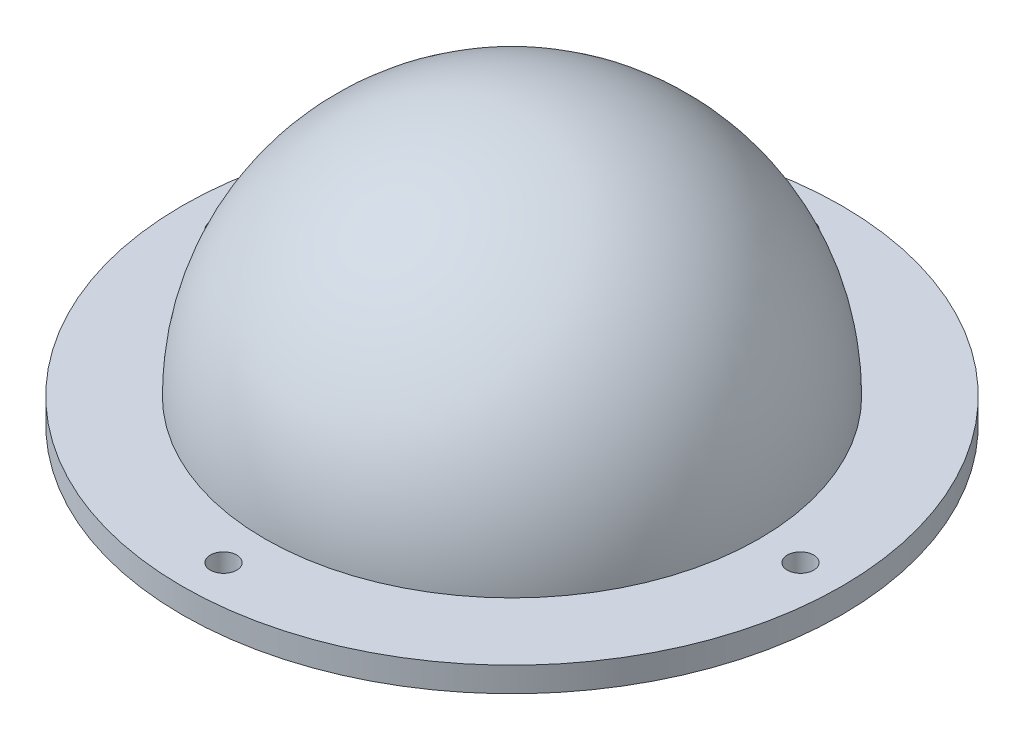
ISO-10303-21;
HEADER;
FILE_DESCRIPTION(('STEP AP214'),'2;1');
FILE_NAME('part.step','',(''),(''),'','','');
FILE_SCHEMA(('AUTOMOTIVE_DESIGN { 1 0 10303 214 1 1 1 1 }'));
ENDSEC;
DATA;
#1=APPLICATION_CONTEXT('core data for automotive mechanical design processes');
#2=APPLICATION_PROTOCOL_DEFINITION('international standard','automotive_design',2000,#1);
#3=PRODUCT_CONTEXT('',#1,'mechanical');
#4=PRODUCT('Part','Part','',(#3));
#5=PRODUCT_RELATED_PRODUCT_CATEGORY('part','',(#4));
#6=PRODUCT_DEFINITION_FORMATION('','',#4);
#7=PRODUCT_DEFINITION_CONTEXT('part definition',#1,'design');
#8=PRODUCT_DEFINITION('design','',#6,#7);
#9=PRODUCT_DEFINITION_SHAPE('','',#8);
#10=(LENGTH_UNIT() NAMED_UNIT(*) SI_UNIT(.MILLI.,.METRE.));
#11=(NAMED_UNIT(*) PLANE_ANGLE_UNIT() SI_UNIT($,.RADIAN.));
#12=(NAMED_UNIT(*) SI_UNIT($,.STERADIAN.) SOLID_ANGLE_UNIT());
#13=UNCERTAINTY_MEASURE_WITH_UNIT(LENGTH_MEASURE(1.E-05),#10,'distance_accuracy_value','');
#14=(GEOMETRIC_REPRESENTATION_CONTEXT(3) GLOBAL_UNCERTAINTY_ASSIGNED_CONTEXT((#13)) GLOBAL_UNIT_ASSIGNED_CONTEXT((#10,
#11,#12)) REPRESENTATION_CONTEXT('',''));
#15=CARTESIAN_POINT('',(0.,0.,0.));
#16=DIRECTION('',(0.,0.,1.));
#17=DIRECTION('',(1.,0.,0.));
#18=AXIS2_PLACEMENT_3D('',#15,#16,#17);
#19=CARTESIAN_POINT('',(0.,-3.,0.));
#20=DIRECTION('',(0.,-1.,0.));
#21=DIRECTION('',(1.,0.,0.));
#22=AXIS2_PLACEMENT_3D('',#19,#20,#21);
#23=PLANE('',#22);
#24=CARTESIAN_POINT('',(0.,-3.,0.));
#25=DIRECTION('',(0.,-1.,0.));
#26=DIRECTION('',(1.,0.,0.));
#27=AXIS2_PLACEMENT_3D('',#24,#25,#26);
#28=CIRCLE('',#27,29.);
#29=CARTESIAN_POINT('',(29.,-3.,0.));
#30=VERTEX_POINT('',#29);
#31=EDGE_CURVE('E96',#30,#30,#28,.T.);
#32=ORIENTED_EDGE('',*,*,#31,.F.);
#33=EDGE_LOOP('',(#32));
#34=FACE_BOUND('',#33,.T.);
#35=CARTESIAN_POINT('',(0.,-3.,-35.));
#36=DIRECTION('',(0.,-1.,0.));
#37=DIRECTION('',(1.,0.,0.));
#38=AXIS2_PLACEMENT_3D('',#35,#36,#37);
#39=CIRCLE('',#38,1.60000000000025);
#40=CARTESIAN_POINT('',(1.60000000000027,-3.,-35.));
#41=VERTEX_POINT('',#40);
#42=EDGE_CURVE('E76',#41,#41,#39,.T.);
#43=ORIENTED_EDGE('',*,*,#42,.F.);
#44=EDGE_LOOP('',(#43));
#45=FACE_BOUND('',#44,.T.);
#46=CARTESIAN_POINT('',(0.,-3.,35.));
#47=DIRECTION('',(0.,-1.,0.));
#48=DIRECTION('',(1.,0.,0.));
#49=AXIS2_PLACEMENT_3D('',#46,#47,#48);
#50=CIRCLE('',#49,1.6);
#51=CARTESIAN_POINT('',(1.6,-3.,35.));
#52=VERTEX_POINT('',#51);
#53=EDGE_CURVE('E62',#52,#52,#50,.T.);
#54=ORIENTED_EDGE('',*,*,#53,.F.);
#55=EDGE_LOOP('',(#54));
#56=FACE_BOUND('',#55,.T.);
#57=CARTESIAN_POINT('',(0.,-3.,0.));
#58=DIRECTION('',(0.,-1.,0.));
#59=DIRECTION('',(1.,0.,0.));
#60=AXIS2_PLACEMENT_3D('',#57,#58,#59);
#61=CIRCLE('',#60,40.);
#62=CARTESIAN_POINT('',(40.,-3.,0.));
#63=VERTEX_POINT('',#62);
#64=EDGE_CURVE('E11',#63,#63,#61,.T.);
#65=ORIENTED_EDGE('',*,*,#64,.T.);
#66=EDGE_LOOP('',(#65));
#67=FACE_BOUND('',#66,.T.);
#68=CARTESIAN_POINT('',(35.,-3.,-1.2220184685951E-13));
#69=DIRECTION('',(0.,-1.,0.));
#70=DIRECTION('',(1.,0.,0.));
#71=AXIS2_PLACEMENT_3D('',#68,#69,#70);
#72=CIRCLE('',#71,1.6);
#73=CARTESIAN_POINT('',(36.6,-3.,-1.2220184685951E-13));
#74=VERTEX_POINT('',#73);
#75=EDGE_CURVE('E68',#74,#74,#72,.T.);
#76=ORIENTED_EDGE('',*,*,#75,.F.);
#77=EDGE_LOOP('',(#76));
#78=FACE_BOUND('',#77,.T.);
#79=CARTESIAN_POINT('',(-35.,-3.,0.));
#80=DIRECTION('',(0.,-1.,0.));
#81=DIRECTION('',(1.,0.,0.));
#82=AXIS2_PLACEMENT_3D('',#79,#80,#81);
#83=CIRCLE('',#82,1.60000000000038);
#84=CARTESIAN_POINT('',(-33.3999999999996,-3.,0.));
#85=VERTEX_POINT('',#84);
#86=EDGE_CURVE('E84',#85,#85,#83,.T.);
#87=ORIENTED_EDGE('',*,*,#86,.F.);
#88=EDGE_LOOP('',(#87));
#89=FACE_BOUND('',#88,.T.);
#90=ADVANCED_FACE('F49',(#34,#45,#56,#67,#78,#89),#23,.T.);
#91=CARTESIAN_POINT('',(0.,0.,0.));
#92=DIRECTION('',(0.,-1.,0.));
#93=DIRECTION('',(1.,0.,0.));
#94=AXIS2_PLACEMENT_3D('',#91,#92,#93);
#95=PLANE('',#94);
#96=CARTESIAN_POINT('',(0.,0.,0.));
#97=DIRECTION('',(0.,-1.,0.));
#98=DIRECTION('',(1.,0.,0.));
#99=AXIS2_PLACEMENT_3D('',#96,#97,#98);
#100=CIRCLE('',#99,29.);
#101=CARTESIAN_POINT('',(29.,0.,0.));
#102=VERTEX_POINT('',#101);
#103=EDGE_CURVE('E92',#102,#102,#100,.T.);
#104=ORIENTED_EDGE('',*,*,#103,.T.);
#105=EDGE_LOOP('',(#104));
#106=FACE_BOUND('',#105,.T.);
#107=CARTESIAN_POINT('',(0.,0.,0.));
#108=DIRECTION('',(0.,-1.,0.));
#109=DIRECTION('',(1.,0.,0.));
#110=AXIS2_PLACEMENT_3D('',#107,#108,#109);
#111=CIRCLE('',#110,40.);
#112=CARTESIAN_POINT('',(40.,0.,0.));
#113=VERTEX_POINT('',#112);
#114=EDGE_CURVE('E53',#113,#113,#111,.T.);
#115=ORIENTED_EDGE('',*,*,#114,.F.);
#116=EDGE_LOOP('',(#115));
#117=FACE_BOUND('',#116,.T.);
#118=CARTESIAN_POINT('',(0.,0.,35.));
#119=DIRECTION('',(0.,-1.,0.));
#120=DIRECTION('',(1.,0.,0.));
#121=AXIS2_PLACEMENT_3D('',#118,#119,#120);
#122=CIRCLE('',#121,1.6);
#123=CARTESIAN_POINT('',(1.6,0.,35.));
#124=VERTEX_POINT('',#123);
#125=EDGE_CURVE('E64',#124,#124,#122,.T.);
#126=ORIENTED_EDGE('',*,*,#125,.T.);
#127=EDGE_LOOP('',(#126));
#128=FACE_BOUND('',#127,.T.);
#129=CARTESIAN_POINT('',(35.,0.,-1.2220184685951E-13));
#130=DIRECTION('',(0.,-1.,0.));
#131=DIRECTION('',(1.,0.,0.));
#132=AXIS2_PLACEMENT_3D('',#129,#130,#131);
#133=CIRCLE('',#132,1.6);
#134=CARTESIAN_POINT('',(36.6,0.,-1.2220184685951E-13));
#135=VERTEX_POINT('',#134);
#136=EDGE_CURVE('E72',#135,#135,#133,.T.);
#137=ORIENTED_EDGE('',*,*,#136,.T.);
#138=EDGE_LOOP('',(#137));
#139=FACE_BOUND('',#138,.T.);
#140=CARTESIAN_POINT('',(0.,0.,-35.));
#141=DIRECTION('',(0.,-1.,0.));
#142=DIRECTION('',(1.,0.,0.));
#143=AXIS2_PLACEMENT_3D('',#140,#141,#142);
#144=CIRCLE('',#143,1.60000000000025);
#145=CARTESIAN_POINT('',(1.60000000000027,0.,-35.));
#146=VERTEX_POINT('',#145);
#147=EDGE_CURVE('E80',#146,#146,#144,.T.);
#148=ORIENTED_EDGE('',*,*,#147,.T.);
#149=EDGE_LOOP('',(#148));
#150=FACE_BOUND('',#149,.T.);
#151=CARTESIAN_POINT('',(-35.,0.,0.));
#152=DIRECTION('',(0.,-1.,0.));
#153=DIRECTION('',(1.,0.,0.));
#154=AXIS2_PLACEMENT_3D('',#151,#152,#153);
#155=CIRCLE('',#154,1.60000000000038);
#156=CARTESIAN_POINT('',(-33.3999999999996,0.,0.));
#157=VERTEX_POINT('',#156);
#158=EDGE_CURVE('E88',#157,#157,#155,.T.);
#159=ORIENTED_EDGE('',*,*,#158,.T.);
#160=EDGE_LOOP('',(#159));
#161=FACE_BOUND('',#160,.T.);
#162=ADVANCED_FACE('F104',(#106,#117,#128,#139,#150,#161),#95,.F.);
#163=CARTESIAN_POINT('',(0.,-3.,0.));
#164=DIRECTION('',(0.,1.,0.));
#165=DIRECTION('',(-1.,0.,0.));
#166=AXIS2_PLACEMENT_3D('',#163,#164,#165);
#167=CYLINDRICAL_SURFACE('',#166,40.);
#168=ORIENTED_EDGE('',*,*,#64,.F.);
#169=EDGE_LOOP('',(#168));
#170=FACE_BOUND('',#169,.T.);
#171=ORIENTED_EDGE('',*,*,#114,.T.);
#172=EDGE_LOOP('',(#171));
#173=FACE_BOUND('',#172,.T.);
#174=ADVANCED_FACE('F51',(#170,#173),#167,.T.);
#175=CARTESIAN_POINT('',(0.,-3.,35.));
#176=DIRECTION('',(0.,1.,0.));
#177=DIRECTION('',(-1.,0.,0.));
#178=AXIS2_PLACEMENT_3D('',#175,#176,#177);
#179=CYLINDRICAL_SURFACE('',#178,1.6);
#180=ORIENTED_EDGE('',*,*,#53,.T.);
#181=EDGE_LOOP('',(#180));
#182=FACE_BOUND('',#181,.T.);
#183=ORIENTED_EDGE('',*,*,#125,.F.);
#184=EDGE_LOOP('',(#183));
#185=FACE_BOUND('',#184,.T.);
#186=ADVANCED_FACE('F135',(#182,#185),#179,.F.);
#187=CARTESIAN_POINT('',(35.,-3.,-1.2220184685951E-13));
#188=DIRECTION('',(0.,1.,0.));
#189=DIRECTION('',(-1.,0.,0.));
#190=AXIS2_PLACEMENT_3D('',#187,#188,#189);
#191=CYLINDRICAL_SURFACE('',#190,1.6);
#192=ORIENTED_EDGE('',*,*,#75,.T.);
#193=EDGE_LOOP('',(#192));
#194=FACE_BOUND('',#193,.T.);
#195=ORIENTED_EDGE('',*,*,#136,.F.);
#196=EDGE_LOOP('',(#195));
#197=FACE_BOUND('',#196,.T.);
#198=ADVANCED_FACE('F140',(#194,#197),#191,.F.);
#199=CARTESIAN_POINT('',(0.,-3.,-35.));
#200=DIRECTION('',(0.,1.,0.));
#201=DIRECTION('',(-1.,0.,0.));
#202=AXIS2_PLACEMENT_3D('',#199,#200,#201);
#203=CYLINDRICAL_SURFACE('',#202,1.60000000000025);
#204=ORIENTED_EDGE('',*,*,#42,.T.);
#205=EDGE_LOOP('',(#204));
#206=FACE_BOUND('',#205,.T.);
#207=ORIENTED_EDGE('',*,*,#147,.F.);
#208=EDGE_LOOP('',(#207));
#209=FACE_BOUND('',#208,.T.);
#210=ADVANCED_FACE('F127',(#206,#209),#203,.F.);
#211=CARTESIAN_POINT('',(-35.,-3.,0.));
#212=DIRECTION('',(0.,1.,0.));
#213=DIRECTION('',(-1.,0.,0.));
#214=AXIS2_PLACEMENT_3D('',#211,#212,#213);
#215=CYLINDRICAL_SURFACE('',#214,1.60000000000038);
#216=ORIENTED_EDGE('',*,*,#86,.T.);
#217=EDGE_LOOP('',(#216));
#218=FACE_BOUND('',#217,.T.);
#219=ORIENTED_EDGE('',*,*,#158,.F.);
#220=EDGE_LOOP('',(#219));
#221=FACE_BOUND('',#220,.T.);
#222=ADVANCED_FACE('F110',(#218,#221),#215,.F.);
#223=CARTESIAN_POINT('',(0.,0.,0.));
#224=DIRECTION('',(0.,-1.,0.));
#225=DIRECTION('',(1.,0.,0.));
#226=AXIS2_PLACEMENT_3D('',#223,#224,#225);
#227=CYLINDRICAL_SURFACE('',#226,29.);
#228=ORIENTED_EDGE('',*,*,#103,.F.);
#229=EDGE_LOOP('',(#228));
#230=FACE_BOUND('',#229,.T.);
#231=ORIENTED_EDGE('',*,*,#31,.T.);
#232=EDGE_LOOP('',(#231));
#233=FACE_BOUND('',#232,.T.);
#234=ADVANCED_FACE('F107',(#230,#233),#227,.F.);
#235=CLOSED_SHELL('',(#90,#162,#174,#186,#198,#210,#222,#234));
#236=MANIFOLD_SOLID_BREP('B2',#235);
#237=CARTESIAN_POINT('',(0.,0.,0.));
#238=DIRECTION('',(0.,1.,0.));
#239=DIRECTION('',(-1.,0.,0.));
#240=AXIS2_PLACEMENT_3D('',#237,#238,#239);
#241=SPHERICAL_SURFACE('',#240,29.);
#242=CARTESIAN_POINT('',(0.,0.,0.));
#243=DIRECTION('',(0.,1.,0.));
#244=DIRECTION('',(-1.,0.,0.));
#245=AXIS2_PLACEMENT_3D('',#242,#243,#244);
#246=CIRCLE('',#245,29.);
#247=CARTESIAN_POINT('',(-29.,0.,0.));
#248=VERTEX_POINT('',#247);
#249=EDGE_CURVE('E229',#248,#248,#246,.T.);
#250=ORIENTED_EDGE('',*,*,#249,.F.);
#251=EDGE_LOOP('',(#250));
#252=FACE_BOUND('',#251,.T.);
#253=ADVANCED_FACE('F223',(#252),#241,.F.);
#254=CARTESIAN_POINT('',(0.,0.,0.));
#255=DIRECTION('',(0.,1.,0.));
#256=DIRECTION('',(1.,0.,0.));
#257=AXIS2_PLACEMENT_3D('',#254,#255,#256);
#258=SPHERICAL_SURFACE('',#257,30.);
#259=CARTESIAN_POINT('',(0.,0.,0.));
#260=DIRECTION('',(0.,1.,0.));
#261=DIRECTION('',(-1.,0.,0.));
#262=AXIS2_PLACEMENT_3D('',#259,#260,#261);
#263=CIRCLE('',#262,30.);
#264=CARTESIAN_POINT('',(-30.,0.,0.));
#265=VERTEX_POINT('',#264);
#266=EDGE_CURVE('E48',#265,#265,#263,.T.);
#267=ORIENTED_EDGE('',*,*,#266,.T.);
#268=EDGE_LOOP('',(#267));
#269=FACE_BOUND('',#268,.T.);
#270=ADVANCED_FACE('F239',(#269),#258,.T.);
#271=CARTESIAN_POINT('',(-30.,0.,0.));
#272=DIRECTION('',(0.,-1.,0.));
#273=DIRECTION('',(1.,0.,0.));
#274=AXIS2_PLACEMENT_3D('',#271,#272,#273);
#275=PLANE('',#274);
#276=ORIENTED_EDGE('',*,*,#249,.T.);
#277=EDGE_LOOP('',(#276));
#278=FACE_BOUND('',#277,.T.);
#279=ORIENTED_EDGE('',*,*,#266,.F.);
#280=EDGE_LOOP('',(#279));
#281=FACE_BOUND('',#280,.T.);
#282=ADVANCED_FACE('F235',(#278,#281),#275,.T.);
#283=CLOSED_SHELL('',(#253,#270,#282));
#284=MANIFOLD_SOLID_BREP('B6',#283);
#285=ADVANCED_BREP_SHAPE_REPRESENTATION('',(#18,#236,#284),#14);
#286=SHAPE_DEFINITION_REPRESENTATION(#9,#285);
ENDSEC;
END-ISO-10303-21;
